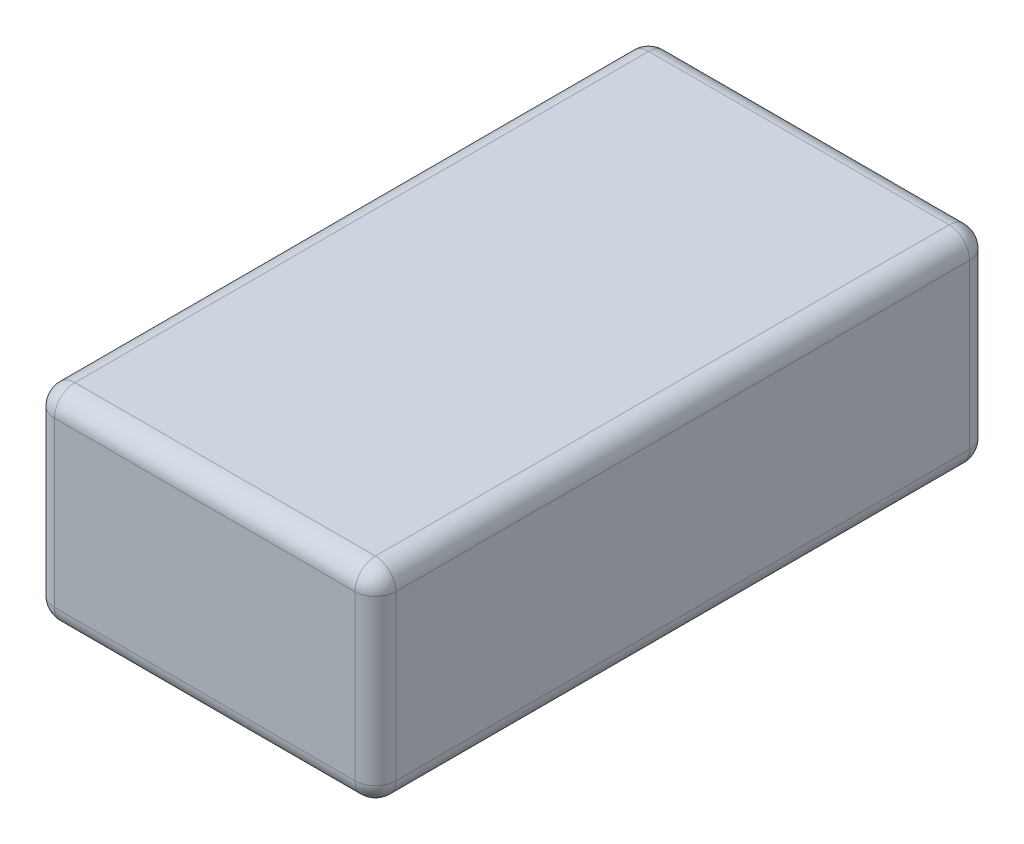
ISO-10303-21;
HEADER;
FILE_DESCRIPTION(('STEP AP214'),'2;1');
FILE_NAME('part.step','',(''),(''),'','','');
FILE_SCHEMA(('AUTOMOTIVE_DESIGN { 1 0 10303 214 1 1 1 1 }'));
ENDSEC;
DATA;
#1=APPLICATION_CONTEXT('core data for automotive mechanical design processes');
#2=APPLICATION_PROTOCOL_DEFINITION('international standard','automotive_design',2000,#1);
#3=PRODUCT_CONTEXT('',#1,'mechanical');
#4=PRODUCT('Part','Part','',(#3));
#5=PRODUCT_RELATED_PRODUCT_CATEGORY('part','',(#4));
#6=PRODUCT_DEFINITION_FORMATION('','',#4);
#7=PRODUCT_DEFINITION_CONTEXT('part definition',#1,'design');
#8=PRODUCT_DEFINITION('design','',#6,#7);
#9=PRODUCT_DEFINITION_SHAPE('','',#8);
#10=(LENGTH_UNIT() NAMED_UNIT(*) SI_UNIT(.MILLI.,.METRE.));
#11=(NAMED_UNIT(*) PLANE_ANGLE_UNIT() SI_UNIT($,.RADIAN.));
#12=(NAMED_UNIT(*) SI_UNIT($,.STERADIAN.) SOLID_ANGLE_UNIT());
#13=UNCERTAINTY_MEASURE_WITH_UNIT(LENGTH_MEASURE(1.E-05),#10,'distance_accuracy_value','');
#14=(GEOMETRIC_REPRESENTATION_CONTEXT(3) GLOBAL_UNCERTAINTY_ASSIGNED_CONTEXT((#13)) GLOBAL_UNIT_ASSIGNED_CONTEXT((#10,
#11,#12)) REPRESENTATION_CONTEXT('',''));
#15=CARTESIAN_POINT('',(0.,0.,0.));
#16=DIRECTION('',(0.,0.,1.));
#17=DIRECTION('',(1.,0.,0.));
#18=AXIS2_PLACEMENT_3D('',#15,#16,#17);
#19=CARTESIAN_POINT('',(-36.6378937101253,18.,-22.9426419750065));
#20=DIRECTION('',(1.,0.,0.));
#21=DIRECTION('',(0.,0.,-1.));
#22=AXIS2_PLACEMENT_3D('',#19,#20,#21);
#23=PLANE('',#22);
#24=DIRECTION('',(0.,-1.,0.));
#25=VECTOR('',#24,1.);
#26=CARTESIAN_POINT('',(-36.6378937101253,18.,-21.4426419750065));
#27=LINE('',#26,#25);
#28=CARTESIAN_POINT('',(-36.6378937101253,16.5,-21.4426419750065));
#29=VERTEX_POINT('',#28);
#30=CARTESIAN_POINT('',(-36.6378937101253,4.5,-21.4426419750065));
#31=VERTEX_POINT('',#30);
#32=EDGE_CURVE('E139',#29,#31,#27,.T.);
#33=ORIENTED_EDGE('',*,*,#32,.T.);
#34=DIRECTION('',(0.,0.,1.));
#35=VECTOR('',#34,1.);
#36=CARTESIAN_POINT('',(-36.6378937101253,4.5,-22.9426419750065));
#37=LINE('',#36,#35);
#38=CARTESIAN_POINT('',(-36.6378937101253,4.5,20.5573580249935));
#39=VERTEX_POINT('',#38);
#40=EDGE_CURVE('E132',#31,#39,#37,.T.);
#41=ORIENTED_EDGE('',*,*,#40,.T.);
#42=DIRECTION('',(0.,-1.,0.));
#43=VECTOR('',#42,1.);
#44=CARTESIAN_POINT('',(-36.6378937101253,18.,20.5573580249935));
#45=LINE('',#44,#43);
#46=CARTESIAN_POINT('',(-36.6378937101253,16.5,20.5573580249935));
#47=VERTEX_POINT('',#46);
#48=EDGE_CURVE('E126',#39,#47,#45,.F.);
#49=ORIENTED_EDGE('',*,*,#48,.T.);
#50=DIRECTION('',(0.,0.,1.));
#51=VECTOR('',#50,1.);
#52=CARTESIAN_POINT('',(-36.6378937101253,16.5,-22.9426419750065));
#53=LINE('',#52,#51);
#54=EDGE_CURVE('E128',#47,#29,#53,.F.);
#55=ORIENTED_EDGE('',*,*,#54,.T.);
#56=EDGE_LOOP('',(#33,#41,#49,#55));
#57=FACE_BOUND('',#56,.T.);
#58=ADVANCED_FACE('F39',(#57),#23,.F.);
#59=CARTESIAN_POINT('',(-36.6378937101253,18.,22.0573580249935));
#60=DIRECTION('',(0.,0.,-1.));
#61=DIRECTION('',(-1.,0.,0.));
#62=AXIS2_PLACEMENT_3D('',#59,#60,#61);
#63=PLANE('',#62);
#64=DIRECTION('',(0.,-1.,0.));
#65=VECTOR('',#64,1.);
#66=CARTESIAN_POINT('',(-35.1378937101253,18.,22.0573580249935));
#67=LINE('',#66,#65);
#68=CARTESIAN_POINT('',(-35.1378937101253,16.5,22.0573580249935));
#69=VERTEX_POINT('',#68);
#70=CARTESIAN_POINT('',(-35.1378937101253,4.5,22.0573580249935));
#71=VERTEX_POINT('',#70);
#72=EDGE_CURVE('E158',#69,#71,#67,.T.);
#73=ORIENTED_EDGE('',*,*,#72,.T.);
#74=DIRECTION('',(1.,0.,0.));
#75=VECTOR('',#74,1.);
#76=CARTESIAN_POINT('',(-36.6378937101253,4.5,22.0573580249935));
#77=LINE('',#76,#75);
#78=CARTESIAN_POINT('',(-13.1378937101253,4.5,22.0573580249935));
#79=VERTEX_POINT('',#78);
#80=EDGE_CURVE('E235',#71,#79,#77,.T.);
#81=ORIENTED_EDGE('',*,*,#80,.T.);
#82=DIRECTION('',(0.,-1.,0.));
#83=VECTOR('',#82,1.);
#84=CARTESIAN_POINT('',(-13.1378937101253,18.,22.0573580249935));
#85=LINE('',#84,#83);
#86=CARTESIAN_POINT('',(-13.1378937101253,16.5,22.0573580249935));
#87=VERTEX_POINT('',#86);
#88=EDGE_CURVE('E234',#79,#87,#85,.F.);
#89=ORIENTED_EDGE('',*,*,#88,.T.);
#90=DIRECTION('',(1.,0.,0.));
#91=VECTOR('',#90,1.);
#92=CARTESIAN_POINT('',(-36.6378937101253,16.5,22.0573580249935));
#93=LINE('',#92,#91);
#94=EDGE_CURVE('E223',#87,#69,#93,.F.);
#95=ORIENTED_EDGE('',*,*,#94,.T.);
#96=EDGE_LOOP('',(#73,#81,#89,#95));
#97=FACE_BOUND('',#96,.T.);
#98=ADVANCED_FACE('F330',(#97),#63,.F.);
#99=CARTESIAN_POINT('',(-11.6378937101253,18.,-22.9426419750065));
#100=DIRECTION('',(-1.,0.,0.));
#101=DIRECTION('',(0.,0.,1.));
#102=AXIS2_PLACEMENT_3D('',#99,#100,#101);
#103=PLANE('',#102);
#104=DIRECTION('',(0.,0.,-1.));
#105=VECTOR('',#104,1.);
#106=CARTESIAN_POINT('',(-11.6378937101253,4.5,-22.9426419750065));
#107=LINE('',#106,#105);
#108=CARTESIAN_POINT('',(-11.6378937101253,4.5,20.5573580249935));
#109=VERTEX_POINT('',#108);
#110=CARTESIAN_POINT('',(-11.6378937101253,4.5,-21.4426419750065));
#111=VERTEX_POINT('',#110);
#112=EDGE_CURVE('E222',#109,#111,#107,.T.);
#113=ORIENTED_EDGE('',*,*,#112,.T.);
#114=DIRECTION('',(0.,-1.,0.));
#115=VECTOR('',#114,1.);
#116=CARTESIAN_POINT('',(-11.6378937101253,18.,-21.4426419750065));
#117=LINE('',#116,#115);
#118=CARTESIAN_POINT('',(-11.6378937101253,16.5,-21.4426419750065));
#119=VERTEX_POINT('',#118);
#120=EDGE_CURVE('E217',#111,#119,#117,.F.);
#121=ORIENTED_EDGE('',*,*,#120,.T.);
#122=DIRECTION('',(0.,0.,-1.));
#123=VECTOR('',#122,1.);
#124=CARTESIAN_POINT('',(-11.6378937101253,16.5,22.0573580249935));
#125=LINE('',#124,#123);
#126=CARTESIAN_POINT('',(-11.6378937101253,16.5,20.5573580249935));
#127=VERTEX_POINT('',#126);
#128=EDGE_CURVE('E211',#119,#127,#125,.F.);
#129=ORIENTED_EDGE('',*,*,#128,.T.);
#130=DIRECTION('',(0.,-1.,0.));
#131=VECTOR('',#130,1.);
#132=CARTESIAN_POINT('',(-11.6378937101253,18.,20.5573580249935));
#133=LINE('',#132,#131);
#134=EDGE_CURVE('E212',#127,#109,#133,.T.);
#135=ORIENTED_EDGE('',*,*,#134,.T.);
#136=EDGE_LOOP('',(#113,#121,#129,#135));
#137=FACE_BOUND('',#136,.T.);
#138=ADVANCED_FACE('F218',(#137),#103,.F.);
#139=CARTESIAN_POINT('',(-36.6378937101253,18.,-22.9426419750065));
#140=DIRECTION('',(0.,0.,1.));
#141=DIRECTION('',(1.,0.,0.));
#142=AXIS2_PLACEMENT_3D('',#139,#140,#141);
#143=PLANE('',#142);
#144=DIRECTION('',(-1.,0.,0.));
#145=VECTOR('',#144,1.);
#146=CARTESIAN_POINT('',(-36.6378937101253,4.5,-22.9426419750065));
#147=LINE('',#146,#145);
#148=CARTESIAN_POINT('',(-13.1378937101253,4.5,-22.9426419750065));
#149=VERTEX_POINT('',#148);
#150=CARTESIAN_POINT('',(-35.1378937101253,4.5,-22.9426419750065));
#151=VERTEX_POINT('',#150);
#152=EDGE_CURVE('E288',#149,#151,#147,.T.);
#153=ORIENTED_EDGE('',*,*,#152,.T.);
#154=DIRECTION('',(0.,-1.,0.));
#155=VECTOR('',#154,1.);
#156=CARTESIAN_POINT('',(-35.1378937101253,18.,-22.9426419750065));
#157=LINE('',#156,#155);
#158=CARTESIAN_POINT('',(-35.1378937101253,16.5,-22.9426419750065));
#159=VERTEX_POINT('',#158);
#160=EDGE_CURVE('E214',#151,#159,#157,.F.);
#161=ORIENTED_EDGE('',*,*,#160,.T.);
#162=DIRECTION('',(-1.,0.,0.));
#163=VECTOR('',#162,1.);
#164=CARTESIAN_POINT('',(-11.6378937101253,16.5,-22.9426419750065));
#165=LINE('',#164,#163);
#166=CARTESIAN_POINT('',(-13.1378937101253,16.5,-22.9426419750065));
#167=VERTEX_POINT('',#166);
#168=EDGE_CURVE('E276',#159,#167,#165,.F.);
#169=ORIENTED_EDGE('',*,*,#168,.T.);
#170=DIRECTION('',(0.,-1.,0.));
#171=VECTOR('',#170,1.);
#172=CARTESIAN_POINT('',(-13.1378937101253,18.,-22.9426419750065));
#173=LINE('',#172,#171);
#174=EDGE_CURVE('E281',#167,#149,#173,.T.);
#175=ORIENTED_EDGE('',*,*,#174,.T.);
#176=EDGE_LOOP('',(#153,#161,#169,#175));
#177=FACE_BOUND('',#176,.T.);
#178=ADVANCED_FACE('F313',(#177),#143,.F.);
#179=CARTESIAN_POINT('',(0.,18.,0.));
#180=DIRECTION('',(0.,1.,0.));
#181=DIRECTION('',(0.,0.,1.));
#182=AXIS2_PLACEMENT_3D('',#179,#180,#181);
#183=PLANE('',#182);
#184=DIRECTION('',(0.,0.,-1.));
#185=VECTOR('',#184,1.);
#186=CARTESIAN_POINT('',(-13.1378937101253,18.,-22.9426419750065));
#187=LINE('',#186,#185);
#188=CARTESIAN_POINT('',(-13.1378937101253,18.,20.5573580249935));
#189=VERTEX_POINT('',#188);
#190=CARTESIAN_POINT('',(-13.1378937101253,18.,-21.4426419750065));
#191=VERTEX_POINT('',#190);
#192=EDGE_CURVE('E48',#189,#191,#187,.T.);
#193=ORIENTED_EDGE('',*,*,#192,.T.);
#194=DIRECTION('',(-1.,0.,0.));
#195=VECTOR('',#194,1.);
#196=CARTESIAN_POINT('',(-36.6378937101253,18.,-21.4426419750065));
#197=LINE('',#196,#195);
#198=CARTESIAN_POINT('',(-35.1378937101253,18.,-21.4426419750065));
#199=VERTEX_POINT('',#198);
#200=EDGE_CURVE('E11',#191,#199,#197,.T.);
#201=ORIENTED_EDGE('',*,*,#200,.T.);
#202=DIRECTION('',(0.,0.,1.));
#203=VECTOR('',#202,1.);
#204=CARTESIAN_POINT('',(-35.1378937101253,18.,22.0573580249935));
#205=LINE('',#204,#203);
#206=CARTESIAN_POINT('',(-35.1378937101253,18.,20.5573580249935));
#207=VERTEX_POINT('',#206);
#208=EDGE_CURVE('E239',#199,#207,#205,.T.);
#209=ORIENTED_EDGE('',*,*,#208,.T.);
#210=DIRECTION('',(1.,0.,0.));
#211=VECTOR('',#210,1.);
#212=CARTESIAN_POINT('',(-11.6378937101253,18.,20.5573580249935));
#213=LINE('',#212,#211);
#214=EDGE_CURVE('E240',#207,#189,#213,.T.);
#215=ORIENTED_EDGE('',*,*,#214,.T.);
#216=EDGE_LOOP('',(#193,#201,#209,#215));
#217=FACE_BOUND('',#216,.T.);
#218=ADVANCED_FACE('F488',(#217),#183,.T.);
#219=CARTESIAN_POINT('',(0.,3.,0.));
#220=DIRECTION('',(0.,1.,0.));
#221=DIRECTION('',(0.,0.,1.));
#222=AXIS2_PLACEMENT_3D('',#219,#220,#221);
#223=PLANE('',#222);
#224=DIRECTION('',(1.,0.,0.));
#225=VECTOR('',#224,1.);
#226=CARTESIAN_POINT('',(0.,3.,20.5573580249935));
#227=LINE('',#226,#225);
#228=CARTESIAN_POINT('',(-13.1378937101253,3.,20.5573580249935));
#229=VERTEX_POINT('',#228);
#230=CARTESIAN_POINT('',(-35.1378937101253,3.,20.5573580249935));
#231=VERTEX_POINT('',#230);
#232=EDGE_CURVE('E274',#229,#231,#227,.F.);
#233=ORIENTED_EDGE('',*,*,#232,.T.);
#234=DIRECTION('',(0.,0.,1.));
#235=VECTOR('',#234,1.);
#236=CARTESIAN_POINT('',(-35.1378937101253,3.,0.));
#237=LINE('',#236,#235);
#238=CARTESIAN_POINT('',(-35.1378937101253,3.,-21.4426419750065));
#239=VERTEX_POINT('',#238);
#240=EDGE_CURVE('E267',#231,#239,#237,.F.);
#241=ORIENTED_EDGE('',*,*,#240,.T.);
#242=DIRECTION('',(-1.,0.,0.));
#243=VECTOR('',#242,1.);
#244=CARTESIAN_POINT('',(0.,3.,-21.4426419750065));
#245=LINE('',#244,#243);
#246=CARTESIAN_POINT('',(-13.1378937101253,3.,-21.4426419750065));
#247=VERTEX_POINT('',#246);
#248=EDGE_CURVE('E263',#239,#247,#245,.F.);
#249=ORIENTED_EDGE('',*,*,#248,.T.);
#250=DIRECTION('',(0.,0.,-1.));
#251=VECTOR('',#250,1.);
#252=CARTESIAN_POINT('',(-13.1378937101253,3.,0.));
#253=LINE('',#252,#251);
#254=EDGE_CURVE('E269',#247,#229,#253,.F.);
#255=ORIENTED_EDGE('',*,*,#254,.T.);
#256=EDGE_LOOP('',(#233,#241,#249,#255));
#257=FACE_BOUND('',#256,.T.);
#258=ADVANCED_FACE('F272',(#257),#223,.F.);
#259=CARTESIAN_POINT('',(-13.1378937101253,16.5,0.));
#260=DIRECTION('',(0.,0.,1.));
#261=DIRECTION('',(1.,0.,0.));
#262=AXIS2_PLACEMENT_3D('',#259,#260,#261);
#263=CYLINDRICAL_SURFACE('',#262,1.5);
#264=CARTESIAN_POINT('',(-13.1378937101253,16.5,-21.4426419750065));
#265=DIRECTION('',(0.,0.,-1.));
#266=DIRECTION('',(-1.,0.,0.));
#267=AXIS2_PLACEMENT_3D('',#264,#265,#266);
#268=CIRCLE('',#267,1.5);
#269=EDGE_CURVE('E43',#191,#119,#268,.T.);
#270=ORIENTED_EDGE('',*,*,#269,.F.);
#271=ORIENTED_EDGE('',*,*,#192,.F.);
#272=CARTESIAN_POINT('',(-13.1378937101253,16.5,20.5573580249935));
#273=DIRECTION('',(0.,0.,1.));
#274=DIRECTION('',(1.,0.,0.));
#275=AXIS2_PLACEMENT_3D('',#272,#273,#274);
#276=CIRCLE('',#275,1.5);
#277=EDGE_CURVE('E198',#127,#189,#276,.T.);
#278=ORIENTED_EDGE('',*,*,#277,.F.);
#279=ORIENTED_EDGE('',*,*,#128,.F.);
#280=EDGE_LOOP('',(#270,#271,#278,#279));
#281=FACE_BOUND('',#280,.T.);
#282=ADVANCED_FACE('F41',(#281),#263,.T.);
#283=CARTESIAN_POINT('',(-13.1378937101253,16.5,-21.4426419750065));
#284=DIRECTION('',(1.,0.,0.));
#285=DIRECTION('',(0.,0.,-1.));
#286=AXIS2_PLACEMENT_3D('',#283,#284,#285);
#287=SPHERICAL_SURFACE('',#286,1.5);
#288=CARTESIAN_POINT('',(-13.1378937101253,16.5,-21.4426419750065));
#289=DIRECTION('',(1.,0.,0.));
#290=DIRECTION('',(0.,1.,0.));
#291=AXIS2_PLACEMENT_3D('',#288,#289,#290);
#292=CIRCLE('',#291,1.5);
#293=EDGE_CURVE('E192',#191,#167,#292,.F.);
#294=ORIENTED_EDGE('',*,*,#293,.F.);
#295=ORIENTED_EDGE('',*,*,#269,.T.);
#296=CARTESIAN_POINT('',(-13.1378937101253,16.5,-21.4426419750065));
#297=DIRECTION('',(0.,1.,0.));
#298=DIRECTION('',(0.,0.,1.));
#299=AXIS2_PLACEMENT_3D('',#296,#297,#298);
#300=CIRCLE('',#299,1.5);
#301=EDGE_CURVE('E191',#167,#119,#300,.F.);
#302=ORIENTED_EDGE('',*,*,#301,.F.);
#303=EDGE_LOOP('',(#294,#295,#302));
#304=FACE_BOUND('',#303,.T.);
#305=ADVANCED_FACE('F210',(#304),#287,.T.);
#306=CARTESIAN_POINT('',(-13.1378937101253,16.5,20.5573580249935));
#307=DIRECTION('',(0.,1.,0.));
#308=DIRECTION('',(0.,0.,1.));
#309=AXIS2_PLACEMENT_3D('',#306,#307,#308);
#310=SPHERICAL_SURFACE('',#309,1.5);
#311=CARTESIAN_POINT('',(-13.1378937101253,16.5,20.5573580249935));
#312=DIRECTION('',(0.,1.,0.));
#313=DIRECTION('',(0.,0.,1.));
#314=AXIS2_PLACEMENT_3D('',#311,#312,#313);
#315=CIRCLE('',#314,1.5);
#316=EDGE_CURVE('E190',#127,#87,#315,.F.);
#317=ORIENTED_EDGE('',*,*,#316,.F.);
#318=ORIENTED_EDGE('',*,*,#277,.T.);
#319=CARTESIAN_POINT('',(-13.1378937101253,16.5,20.5573580249935));
#320=DIRECTION('',(1.,0.,0.));
#321=DIRECTION('',(0.,0.,-1.));
#322=AXIS2_PLACEMENT_3D('',#319,#320,#321);
#323=CIRCLE('',#322,1.5);
#324=EDGE_CURVE('E189',#87,#189,#323,.F.);
#325=ORIENTED_EDGE('',*,*,#324,.F.);
#326=EDGE_LOOP('',(#317,#318,#325));
#327=FACE_BOUND('',#326,.T.);
#328=ADVANCED_FACE('F461',(#327),#310,.T.);
#329=CARTESIAN_POINT('',(-13.1378937101253,18.,-21.4426419750065));
#330=DIRECTION('',(0.,-1.,0.));
#331=DIRECTION('',(0.,0.,-1.));
#332=AXIS2_PLACEMENT_3D('',#329,#330,#331);
#333=CYLINDRICAL_SURFACE('',#332,1.5);
#334=ORIENTED_EDGE('',*,*,#301,.T.);
#335=ORIENTED_EDGE('',*,*,#120,.F.);
#336=CARTESIAN_POINT('',(-13.1378937101253,4.5,-21.4426419750065));
#337=DIRECTION('',(0.,-1.,0.));
#338=DIRECTION('',(0.,0.,-1.));
#339=AXIS2_PLACEMENT_3D('',#336,#337,#338);
#340=CIRCLE('',#339,1.5);
#341=EDGE_CURVE('E182',#149,#111,#340,.T.);
#342=ORIENTED_EDGE('',*,*,#341,.F.);
#343=ORIENTED_EDGE('',*,*,#174,.F.);
#344=EDGE_LOOP('',(#334,#335,#342,#343));
#345=FACE_BOUND('',#344,.T.);
#346=ADVANCED_FACE('F311',(#345),#333,.T.);
#347=CARTESIAN_POINT('',(0.,16.5,-21.4426419750065));
#348=DIRECTION('',(1.,0.,0.));
#349=DIRECTION('',(0.,0.,-1.));
#350=AXIS2_PLACEMENT_3D('',#347,#348,#349);
#351=CYLINDRICAL_SURFACE('',#350,1.5);
#352=ORIENTED_EDGE('',*,*,#293,.T.);
#353=ORIENTED_EDGE('',*,*,#168,.F.);
#354=CARTESIAN_POINT('',(-35.1378937101253,16.5,-21.4426419750065));
#355=DIRECTION('',(-1.,0.,0.));
#356=DIRECTION('',(0.,0.,1.));
#357=AXIS2_PLACEMENT_3D('',#354,#355,#356);
#358=CIRCLE('',#357,1.5);
#359=EDGE_CURVE('E177',#199,#159,#358,.T.);
#360=ORIENTED_EDGE('',*,*,#359,.F.);
#361=ORIENTED_EDGE('',*,*,#200,.F.);
#362=EDGE_LOOP('',(#352,#353,#360,#361));
#363=FACE_BOUND('',#362,.T.);
#364=ADVANCED_FACE('F446',(#363),#351,.T.);
#365=CARTESIAN_POINT('',(-35.1378937101253,16.5,0.));
#366=DIRECTION('',(0.,0.,-1.));
#367=DIRECTION('',(-1.,0.,0.));
#368=AXIS2_PLACEMENT_3D('',#365,#366,#367);
#369=CYLINDRICAL_SURFACE('',#368,1.5);
#370=CARTESIAN_POINT('',(-35.1378937101253,16.5,20.5573580249935));
#371=DIRECTION('',(0.,0.,1.));
#372=DIRECTION('',(1.,0.,0.));
#373=AXIS2_PLACEMENT_3D('',#370,#371,#372);
#374=CIRCLE('',#373,1.5);
#375=EDGE_CURVE('E141',#207,#47,#374,.T.);
#376=ORIENTED_EDGE('',*,*,#375,.F.);
#377=ORIENTED_EDGE('',*,*,#208,.F.);
#378=CARTESIAN_POINT('',(-35.1378937101253,16.5,-21.4426419750065));
#379=DIRECTION('',(0.,0.,-1.));
#380=DIRECTION('',(-1.,0.,0.));
#381=AXIS2_PLACEMENT_3D('',#378,#379,#380);
#382=CIRCLE('',#381,1.5);
#383=EDGE_CURVE('E148',#29,#199,#382,.T.);
#384=ORIENTED_EDGE('',*,*,#383,.F.);
#385=ORIENTED_EDGE('',*,*,#54,.F.);
#386=EDGE_LOOP('',(#376,#377,#384,#385));
#387=FACE_BOUND('',#386,.T.);
#388=ADVANCED_FACE('F142',(#387),#369,.T.);
#389=CARTESIAN_POINT('',(0.,16.5,20.5573580249935));
#390=DIRECTION('',(-1.,0.,0.));
#391=DIRECTION('',(0.,0.,1.));
#392=AXIS2_PLACEMENT_3D('',#389,#390,#391);
#393=CYLINDRICAL_SURFACE('',#392,1.5);
#394=ORIENTED_EDGE('',*,*,#324,.T.);
#395=ORIENTED_EDGE('',*,*,#214,.F.);
#396=CARTESIAN_POINT('',(-35.1378937101253,16.5,20.5573580249935));
#397=DIRECTION('',(-1.,0.,0.));
#398=DIRECTION('',(0.,0.,1.));
#399=AXIS2_PLACEMENT_3D('',#396,#397,#398);
#400=CIRCLE('',#399,1.5);
#401=EDGE_CURVE('E154',#69,#207,#400,.T.);
#402=ORIENTED_EDGE('',*,*,#401,.F.);
#403=ORIENTED_EDGE('',*,*,#94,.F.);
#404=EDGE_LOOP('',(#394,#395,#402,#403));
#405=FACE_BOUND('',#404,.T.);
#406=ADVANCED_FACE('F429',(#405),#393,.T.);
#407=CARTESIAN_POINT('',(-13.1378937101253,18.,20.5573580249935));
#408=DIRECTION('',(0.,-1.,0.));
#409=DIRECTION('',(0.,0.,-1.));
#410=AXIS2_PLACEMENT_3D('',#407,#408,#409);
#411=CYLINDRICAL_SURFACE('',#410,1.5);
#412=ORIENTED_EDGE('',*,*,#316,.T.);
#413=ORIENTED_EDGE('',*,*,#88,.F.);
#414=CARTESIAN_POINT('',(-13.1378937101253,4.5,20.5573580249935));
#415=DIRECTION('',(0.,-1.,0.));
#416=DIRECTION('',(0.,0.,-1.));
#417=AXIS2_PLACEMENT_3D('',#414,#415,#416);
#418=CIRCLE('',#417,1.5);
#419=EDGE_CURVE('E172',#109,#79,#418,.T.);
#420=ORIENTED_EDGE('',*,*,#419,.F.);
#421=ORIENTED_EDGE('',*,*,#134,.F.);
#422=EDGE_LOOP('',(#412,#413,#420,#421));
#423=FACE_BOUND('',#422,.T.);
#424=ADVANCED_FACE('F300',(#423),#411,.T.);
#425=CARTESIAN_POINT('',(-13.1378937101253,4.5,-22.9426419750065));
#426=DIRECTION('',(0.,0.,-1.));
#427=DIRECTION('',(-1.,0.,0.));
#428=AXIS2_PLACEMENT_3D('',#425,#426,#427);
#429=CYLINDRICAL_SURFACE('',#428,1.5);
#430=CARTESIAN_POINT('',(-13.1378937101253,4.5,-21.4426419750065));
#431=DIRECTION('',(0.,0.,-1.));
#432=DIRECTION('',(-1.,0.,0.));
#433=AXIS2_PLACEMENT_3D('',#430,#431,#432);
#434=CIRCLE('',#433,1.5);
#435=EDGE_CURVE('E184',#111,#247,#434,.T.);
#436=ORIENTED_EDGE('',*,*,#435,.F.);
#437=ORIENTED_EDGE('',*,*,#112,.F.);
#438=CARTESIAN_POINT('',(-13.1378937101253,4.5,20.5573580249935));
#439=DIRECTION('',(0.,0.,1.));
#440=DIRECTION('',(1.,0.,0.));
#441=AXIS2_PLACEMENT_3D('',#438,#439,#440);
#442=CIRCLE('',#441,1.5);
#443=EDGE_CURVE('E168',#229,#109,#442,.T.);
#444=ORIENTED_EDGE('',*,*,#443,.F.);
#445=ORIENTED_EDGE('',*,*,#254,.F.);
#446=EDGE_LOOP('',(#436,#437,#444,#445));
#447=FACE_BOUND('',#446,.T.);
#448=ADVANCED_FACE('F294',(#447),#429,.T.);
#449=CARTESIAN_POINT('',(-13.1378937101253,4.5,-21.4426419750065));
#450=DIRECTION('',(1.,0.,0.));
#451=DIRECTION('',(0.,0.,-1.));
#452=AXIS2_PLACEMENT_3D('',#449,#450,#451);
#453=SPHERICAL_SURFACE('',#452,1.5);
#454=ORIENTED_EDGE('',*,*,#341,.T.);
#455=ORIENTED_EDGE('',*,*,#435,.T.);
#456=CARTESIAN_POINT('',(-13.1378937101253,4.5,-21.4426419750065));
#457=DIRECTION('',(1.,0.,0.));
#458=DIRECTION('',(0.,0.,-1.));
#459=AXIS2_PLACEMENT_3D('',#456,#457,#458);
#460=CIRCLE('',#459,1.5);
#461=EDGE_CURVE('E165',#149,#247,#460,.F.);
#462=ORIENTED_EDGE('',*,*,#461,.F.);
#463=EDGE_LOOP('',(#454,#455,#462));
#464=FACE_BOUND('',#463,.T.);
#465=ADVANCED_FACE('F312',(#464),#453,.T.);
#466=CARTESIAN_POINT('',(-35.1378937101253,16.5,-21.4426419750065));
#467=DIRECTION('',(0.,1.,0.));
#468=DIRECTION('',(0.,0.,1.));
#469=AXIS2_PLACEMENT_3D('',#466,#467,#468);
#470=SPHERICAL_SURFACE('',#469,1.5);
#471=ORIENTED_EDGE('',*,*,#383,.T.);
#472=ORIENTED_EDGE('',*,*,#359,.T.);
#473=CARTESIAN_POINT('',(-35.1378937101253,16.5,-21.4426419750065));
#474=DIRECTION('',(0.,1.,0.));
#475=DIRECTION('',(0.,0.,1.));
#476=AXIS2_PLACEMENT_3D('',#473,#474,#475);
#477=CIRCLE('',#476,1.5);
#478=EDGE_CURVE('E157',#29,#159,#477,.F.);
#479=ORIENTED_EDGE('',*,*,#478,.F.);
#480=EDGE_LOOP('',(#471,#472,#479));
#481=FACE_BOUND('',#480,.T.);
#482=ADVANCED_FACE('F320',(#481),#470,.T.);
#483=CARTESIAN_POINT('',(-35.1378937101253,16.5,20.5573580249935));
#484=DIRECTION('',(0.,1.,0.));
#485=DIRECTION('',(0.,0.,1.));
#486=AXIS2_PLACEMENT_3D('',#483,#484,#485);
#487=SPHERICAL_SURFACE('',#486,1.5);
#488=ORIENTED_EDGE('',*,*,#401,.T.);
#489=ORIENTED_EDGE('',*,*,#375,.T.);
#490=CARTESIAN_POINT('',(-35.1378937101253,16.5,20.5573580249935));
#491=DIRECTION('',(0.,1.,0.));
#492=DIRECTION('',(0.,0.,1.));
#493=AXIS2_PLACEMENT_3D('',#490,#491,#492);
#494=CIRCLE('',#493,1.5);
#495=EDGE_CURVE('E155',#69,#47,#494,.F.);
#496=ORIENTED_EDGE('',*,*,#495,.F.);
#497=EDGE_LOOP('',(#488,#489,#496));
#498=FACE_BOUND('',#497,.T.);
#499=ADVANCED_FACE('F151',(#498),#487,.T.);
#500=CARTESIAN_POINT('',(-13.1378937101253,4.5,20.5573580249935));
#501=DIRECTION('',(1.,0.,0.));
#502=DIRECTION('',(0.,0.,-1.));
#503=AXIS2_PLACEMENT_3D('',#500,#501,#502);
#504=SPHERICAL_SURFACE('',#503,1.5);
#505=ORIENTED_EDGE('',*,*,#443,.T.);
#506=ORIENTED_EDGE('',*,*,#419,.T.);
#507=CARTESIAN_POINT('',(-13.1378937101253,4.5,20.5573580249935));
#508=DIRECTION('',(1.,0.,0.));
#509=DIRECTION('',(0.,0.,-1.));
#510=AXIS2_PLACEMENT_3D('',#507,#508,#509);
#511=CIRCLE('',#510,1.5);
#512=EDGE_CURVE('E159',#229,#79,#511,.F.);
#513=ORIENTED_EDGE('',*,*,#512,.F.);
#514=EDGE_LOOP('',(#505,#506,#513));
#515=FACE_BOUND('',#514,.T.);
#516=ADVANCED_FACE('F298',(#515),#504,.T.);
#517=CARTESIAN_POINT('',(-36.6378937101253,4.5,-21.4426419750065));
#518=DIRECTION('',(-1.,0.,0.));
#519=DIRECTION('',(0.,0.,1.));
#520=AXIS2_PLACEMENT_3D('',#517,#518,#519);
#521=CYLINDRICAL_SURFACE('',#520,1.5);
#522=ORIENTED_EDGE('',*,*,#461,.T.);
#523=ORIENTED_EDGE('',*,*,#248,.F.);
#524=CARTESIAN_POINT('',(-35.1378937101253,4.5,-21.4426419750065));
#525=DIRECTION('',(-1.,0.,0.));
#526=DIRECTION('',(0.,0.,1.));
#527=AXIS2_PLACEMENT_3D('',#524,#525,#526);
#528=CIRCLE('',#527,1.5);
#529=EDGE_CURVE('E163',#151,#239,#528,.T.);
#530=ORIENTED_EDGE('',*,*,#529,.F.);
#531=ORIENTED_EDGE('',*,*,#152,.F.);
#532=EDGE_LOOP('',(#522,#523,#530,#531));
#533=FACE_BOUND('',#532,.T.);
#534=ADVANCED_FACE('F264',(#533),#521,.T.);
#535=CARTESIAN_POINT('',(-35.1378937101253,18.,-21.4426419750065));
#536=DIRECTION('',(0.,-1.,0.));
#537=DIRECTION('',(0.,0.,-1.));
#538=AXIS2_PLACEMENT_3D('',#535,#536,#537);
#539=CYLINDRICAL_SURFACE('',#538,1.5);
#540=ORIENTED_EDGE('',*,*,#478,.T.);
#541=ORIENTED_EDGE('',*,*,#160,.F.);
#542=CARTESIAN_POINT('',(-35.1378937101253,4.5,-21.4426419750065));
#543=DIRECTION('',(0.,-1.,0.));
#544=DIRECTION('',(0.,0.,-1.));
#545=AXIS2_PLACEMENT_3D('',#542,#543,#544);
#546=CIRCLE('',#545,1.5);
#547=EDGE_CURVE('E252',#31,#151,#546,.T.);
#548=ORIENTED_EDGE('',*,*,#547,.F.);
#549=ORIENTED_EDGE('',*,*,#32,.F.);
#550=EDGE_LOOP('',(#540,#541,#548,#549));
#551=FACE_BOUND('',#550,.T.);
#552=ADVANCED_FACE('F310',(#551),#539,.T.);
#553=CARTESIAN_POINT('',(-35.1378937101253,18.,20.5573580249935));
#554=DIRECTION('',(0.,-1.,0.));
#555=DIRECTION('',(0.,0.,-1.));
#556=AXIS2_PLACEMENT_3D('',#553,#554,#555);
#557=CYLINDRICAL_SURFACE('',#556,1.5);
#558=ORIENTED_EDGE('',*,*,#495,.T.);
#559=ORIENTED_EDGE('',*,*,#48,.F.);
#560=CARTESIAN_POINT('',(-35.1378937101253,4.5,20.5573580249935));
#561=DIRECTION('',(0.,-1.,0.));
#562=DIRECTION('',(0.,0.,-1.));
#563=AXIS2_PLACEMENT_3D('',#560,#561,#562);
#564=CIRCLE('',#563,1.5);
#565=EDGE_CURVE('E250',#71,#39,#564,.T.);
#566=ORIENTED_EDGE('',*,*,#565,.F.);
#567=ORIENTED_EDGE('',*,*,#72,.F.);
#568=EDGE_LOOP('',(#558,#559,#566,#567));
#569=FACE_BOUND('',#568,.T.);
#570=ADVANCED_FACE('F160',(#569),#557,.T.);
#571=CARTESIAN_POINT('',(-36.6378937101253,4.5,20.5573580249935));
#572=DIRECTION('',(1.,0.,0.));
#573=DIRECTION('',(0.,0.,-1.));
#574=AXIS2_PLACEMENT_3D('',#571,#572,#573);
#575=CYLINDRICAL_SURFACE('',#574,1.5);
#576=ORIENTED_EDGE('',*,*,#512,.T.);
#577=ORIENTED_EDGE('',*,*,#80,.F.);
#578=CARTESIAN_POINT('',(-35.1378937101253,4.5,20.5573580249935));
#579=DIRECTION('',(-1.,0.,0.));
#580=DIRECTION('',(0.,0.,1.));
#581=AXIS2_PLACEMENT_3D('',#578,#579,#580);
#582=CIRCLE('',#581,1.5);
#583=EDGE_CURVE('E248',#231,#71,#582,.T.);
#584=ORIENTED_EDGE('',*,*,#583,.F.);
#585=ORIENTED_EDGE('',*,*,#232,.F.);
#586=EDGE_LOOP('',(#576,#577,#584,#585));
#587=FACE_BOUND('',#586,.T.);
#588=ADVANCED_FACE('F304',(#587),#575,.T.);
#589=CARTESIAN_POINT('',(-35.1378937101253,4.5,-21.4426419750065));
#590=DIRECTION('',(0.,0.,-1.));
#591=DIRECTION('',(-1.,0.,0.));
#592=AXIS2_PLACEMENT_3D('',#589,#590,#591);
#593=SPHERICAL_SURFACE('',#592,1.5);
#594=ORIENTED_EDGE('',*,*,#547,.T.);
#595=ORIENTED_EDGE('',*,*,#529,.T.);
#596=CARTESIAN_POINT('',(-35.1378937101253,4.5,-21.4426419750065));
#597=DIRECTION('',(0.,0.,-1.));
#598=DIRECTION('',(-1.,0.,0.));
#599=AXIS2_PLACEMENT_3D('',#596,#597,#598);
#600=CIRCLE('',#599,1.5);
#601=EDGE_CURVE('E243',#31,#239,#600,.F.);
#602=ORIENTED_EDGE('',*,*,#601,.F.);
#603=EDGE_LOOP('',(#594,#595,#602));
#604=FACE_BOUND('',#603,.T.);
#605=ADVANCED_FACE('F259',(#604),#593,.T.);
#606=CARTESIAN_POINT('',(-35.1378937101253,4.5,20.5573580249935));
#607=DIRECTION('',(0.,0.,1.));
#608=DIRECTION('',(1.,0.,0.));
#609=AXIS2_PLACEMENT_3D('',#606,#607,#608);
#610=SPHERICAL_SURFACE('',#609,1.5);
#611=ORIENTED_EDGE('',*,*,#583,.T.);
#612=ORIENTED_EDGE('',*,*,#565,.T.);
#613=CARTESIAN_POINT('',(-35.1378937101253,4.5,20.5573580249935));
#614=DIRECTION('',(0.,0.,1.));
#615=DIRECTION('',(1.,0.,0.));
#616=AXIS2_PLACEMENT_3D('',#613,#614,#615);
#617=CIRCLE('',#616,1.5);
#618=EDGE_CURVE('E245',#231,#39,#617,.F.);
#619=ORIENTED_EDGE('',*,*,#618,.F.);
#620=EDGE_LOOP('',(#611,#612,#619));
#621=FACE_BOUND('',#620,.T.);
#622=ADVANCED_FACE('F338',(#621),#610,.T.);
#623=CARTESIAN_POINT('',(-35.1378937101253,4.5,-22.9426419750065));
#624=DIRECTION('',(0.,0.,1.));
#625=DIRECTION('',(1.,0.,0.));
#626=AXIS2_PLACEMENT_3D('',#623,#624,#625);
#627=CYLINDRICAL_SURFACE('',#626,1.5);
#628=ORIENTED_EDGE('',*,*,#601,.T.);
#629=ORIENTED_EDGE('',*,*,#240,.F.);
#630=ORIENTED_EDGE('',*,*,#618,.T.);
#631=ORIENTED_EDGE('',*,*,#40,.F.);
#632=EDGE_LOOP('',(#628,#629,#630,#631));
#633=FACE_BOUND('',#632,.T.);
#634=ADVANCED_FACE('F336',(#633),#627,.T.);
#635=CLOSED_SHELL('',(#58,#98,#138,#178,#218,#258,#282,#305,#328,#346,#364,#388,#406,#424,#448,
#465,#482,#499,#516,#534,#552,#570,#588,#605,#622,#634));
#636=MANIFOLD_SOLID_BREP('B2',#635);
#637=ADVANCED_BREP_SHAPE_REPRESENTATION('',(#18,#636),#14);
#638=SHAPE_DEFINITION_REPRESENTATION(#9,#637);
ENDSEC;
END-ISO-10303-21;
